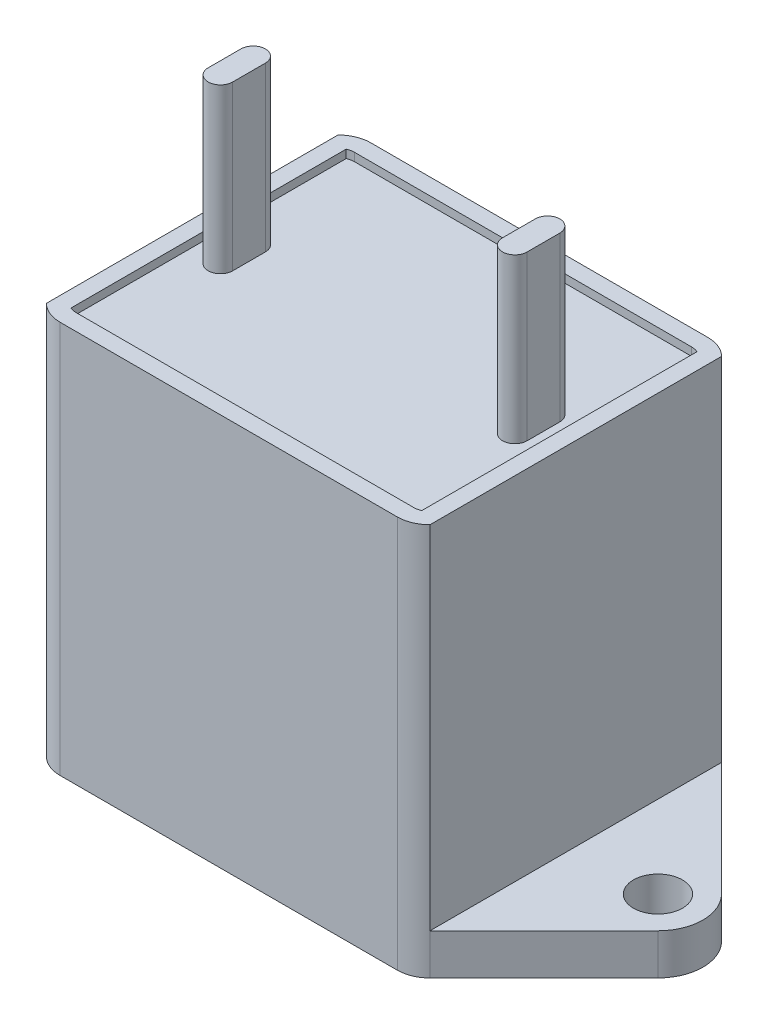
ISO-10303-21;
HEADER;
FILE_DESCRIPTION(('STEP AP214'),'2;1');
FILE_NAME('part.step','',(''),(''),'','','');
FILE_SCHEMA(('AUTOMOTIVE_DESIGN { 1 0 10303 214 1 1 1 1 }'));
ENDSEC;
DATA;
#1=APPLICATION_CONTEXT('core data for automotive mechanical design processes');
#2=APPLICATION_PROTOCOL_DEFINITION('international standard','automotive_design',2000,#1);
#3=PRODUCT_CONTEXT('',#1,'mechanical');
#4=PRODUCT('Part','Part','',(#3));
#5=PRODUCT_RELATED_PRODUCT_CATEGORY('part','',(#4));
#6=PRODUCT_DEFINITION_FORMATION('','',#4);
#7=PRODUCT_DEFINITION_CONTEXT('part definition',#1,'design');
#8=PRODUCT_DEFINITION('design','',#6,#7);
#9=PRODUCT_DEFINITION_SHAPE('','',#8);
#10=(LENGTH_UNIT() NAMED_UNIT(*) SI_UNIT(.MILLI.,.METRE.));
#11=(NAMED_UNIT(*) PLANE_ANGLE_UNIT() SI_UNIT($,.RADIAN.));
#12=(NAMED_UNIT(*) SI_UNIT($,.STERADIAN.) SOLID_ANGLE_UNIT());
#13=UNCERTAINTY_MEASURE_WITH_UNIT(LENGTH_MEASURE(1.E-05),#10,'distance_accuracy_value','');
#14=(GEOMETRIC_REPRESENTATION_CONTEXT(3) GLOBAL_UNCERTAINTY_ASSIGNED_CONTEXT((#13)) GLOBAL_UNIT_ASSIGNED_CONTEXT((#10,
#11,#12)) REPRESENTATION_CONTEXT('',''));
#15=CARTESIAN_POINT('',(0.,0.,0.));
#16=DIRECTION('',(0.,0.,1.));
#17=DIRECTION('',(1.,0.,0.));
#18=AXIS2_PLACEMENT_3D('',#15,#16,#17);
#19=CARTESIAN_POINT('',(10.3106601717799,23.5,7.5));
#20=DIRECTION('',(0.,1.,0.));
#21=DIRECTION('',(0.,0.,1.));
#22=AXIS2_PLACEMENT_3D('',#19,#20,#21);
#23=PLANE('',#22);
#24=CARTESIAN_POINT('',(10.3106601717799,23.5,7.5));
#25=DIRECTION('',(0.,1.,0.));
#26=DIRECTION('',(0.,0.,1.));
#27=AXIS2_PLACEMENT_3D('',#24,#25,#26);
#28=CIRCLE('',#27,1.);
#29=CARTESIAN_POINT('',(10.3106601717799,23.5,8.5));
#30=VERTEX_POINT('',#29);
#31=CARTESIAN_POINT('',(10.7248737341529,23.5,8.41017972112446));
#32=VERTEX_POINT('',#31);
#33=EDGE_CURVE('E292',#30,#32,#28,.T.);
#34=ORIENTED_EDGE('',*,*,#33,.T.);
#35=DIRECTION('',(0.,0.,-1.));
#36=VECTOR('',#35,1.);
#37=CARTESIAN_POINT('',(10.7248737341529,23.5,8.41017972112446));
#38=LINE('',#37,#36);
#39=CARTESIAN_POINT('',(10.724873734153,23.5,-8.41017972112445));
#40=VERTEX_POINT('',#39);
#41=EDGE_CURVE('E295',#32,#40,#38,.T.);
#42=ORIENTED_EDGE('',*,*,#41,.T.);
#43=CARTESIAN_POINT('',(10.3106601717799,23.5,-7.5));
#44=DIRECTION('',(0.,1.,0.));
#45=DIRECTION('',(0.,0.,1.));
#46=AXIS2_PLACEMENT_3D('',#43,#44,#45);
#47=CIRCLE('',#46,1.);
#48=CARTESIAN_POINT('',(10.3106601717799,23.5,-8.5));
#49=VERTEX_POINT('',#48);
#50=EDGE_CURVE('E299',#40,#49,#47,.T.);
#51=ORIENTED_EDGE('',*,*,#50,.T.);
#52=DIRECTION('',(-1.,0.,0.));
#53=VECTOR('',#52,1.);
#54=CARTESIAN_POINT('',(10.3106601717799,23.5,-8.5));
#55=LINE('',#54,#53);
#56=CARTESIAN_POINT('',(-10.3106601717799,23.5,-8.5));
#57=VERTEX_POINT('',#56);
#58=EDGE_CURVE('E302',#49,#57,#55,.T.);
#59=ORIENTED_EDGE('',*,*,#58,.T.);
#60=CARTESIAN_POINT('',(-10.3106601717799,23.5,-7.5));
#61=DIRECTION('',(0.,1.,0.));
#62=DIRECTION('',(0.,0.,1.));
#63=AXIS2_PLACEMENT_3D('',#60,#61,#62);
#64=CIRCLE('',#63,1.);
#65=CARTESIAN_POINT('',(-10.724873734153,23.5,-8.41017972112445));
#66=VERTEX_POINT('',#65);
#67=EDGE_CURVE('E305',#57,#66,#64,.T.);
#68=ORIENTED_EDGE('',*,*,#67,.T.);
#69=DIRECTION('',(0.,0.,1.));
#70=VECTOR('',#69,1.);
#71=CARTESIAN_POINT('',(-10.724873734153,23.5,-8.41017972112445));
#72=LINE('',#71,#70);
#73=CARTESIAN_POINT('',(-10.7248737341529,23.5,8.41017972112446));
#74=VERTEX_POINT('',#73);
#75=EDGE_CURVE('E308',#66,#74,#72,.T.);
#76=ORIENTED_EDGE('',*,*,#75,.T.);
#77=CARTESIAN_POINT('',(-10.3106601717798,23.5,7.5));
#78=DIRECTION('',(0.,1.,0.));
#79=DIRECTION('',(0.,0.,1.));
#80=AXIS2_PLACEMENT_3D('',#77,#78,#79);
#81=CIRCLE('',#80,1.);
#82=CARTESIAN_POINT('',(-10.3106601717798,23.5,8.5));
#83=VERTEX_POINT('',#82);
#84=EDGE_CURVE('E311',#74,#83,#81,.T.);
#85=ORIENTED_EDGE('',*,*,#84,.T.);
#86=DIRECTION('',(1.,0.,0.));
#87=VECTOR('',#86,1.);
#88=CARTESIAN_POINT('',(-10.3106601717798,23.5,8.5));
#89=LINE('',#88,#87);
#90=EDGE_CURVE('E314',#83,#30,#89,.T.);
#91=ORIENTED_EDGE('',*,*,#90,.T.);
#92=EDGE_LOOP('',(#34,#42,#51,#59,#68,#76,#85,#91));
#93=FACE_BOUND('',#92,.T.);
#94=DIRECTION('',(0.,0.,1.));
#95=VECTOR('',#94,1.);
#96=CARTESIAN_POINT('',(-9.75,23.5,-1.));
#97=LINE('',#96,#95);
#98=CARTESIAN_POINT('',(-9.75,23.5,-1.));
#99=VERTEX_POINT('',#98);
#100=CARTESIAN_POINT('',(-9.75,23.5,1.));
#101=VERTEX_POINT('',#100);
#102=EDGE_CURVE('E263',#99,#101,#97,.T.);
#103=ORIENTED_EDGE('',*,*,#102,.F.);
#104=CARTESIAN_POINT('',(-9.,23.5,-1.));
#105=DIRECTION('',(0.,1.,0.));
#106=DIRECTION('',(0.,0.,1.));
#107=AXIS2_PLACEMENT_3D('',#104,#105,#106);
#108=CIRCLE('',#107,0.750000000000001);
#109=CARTESIAN_POINT('',(-8.25,23.5,-1.));
#110=VERTEX_POINT('',#109);
#111=EDGE_CURVE('E260',#110,#99,#108,.T.);
#112=ORIENTED_EDGE('',*,*,#111,.F.);
#113=DIRECTION('',(0.,0.,-1.));
#114=VECTOR('',#113,1.);
#115=CARTESIAN_POINT('',(-8.25,23.5,-1.));
#116=LINE('',#115,#114);
#117=CARTESIAN_POINT('',(-8.24999999999999,23.5,1.));
#118=VERTEX_POINT('',#117);
#119=EDGE_CURVE('E272',#118,#110,#116,.T.);
#120=ORIENTED_EDGE('',*,*,#119,.F.);
#121=CARTESIAN_POINT('',(-9.,23.5,1.));
#122=DIRECTION('',(0.,1.,0.));
#123=DIRECTION('',(0.,0.,1.));
#124=AXIS2_PLACEMENT_3D('',#121,#122,#123);
#125=CIRCLE('',#124,0.750000000000001);
#126=EDGE_CURVE('E280',#101,#118,#125,.T.);
#127=ORIENTED_EDGE('',*,*,#126,.F.);
#128=EDGE_LOOP('',(#103,#112,#120,#127));
#129=FACE_BOUND('',#128,.T.);
#130=DIRECTION('',(0.,0.,1.));
#131=VECTOR('',#130,1.);
#132=CARTESIAN_POINT('',(8.24999999999999,23.5,-1.));
#133=LINE('',#132,#131);
#134=CARTESIAN_POINT('',(8.24999999999999,23.5,-1.));
#135=VERTEX_POINT('',#134);
#136=CARTESIAN_POINT('',(8.24999999999999,23.5,1.));
#137=VERTEX_POINT('',#136);
#138=EDGE_CURVE('E974',#135,#137,#133,.T.);
#139=ORIENTED_EDGE('',*,*,#138,.F.);
#140=CARTESIAN_POINT('',(8.99999999999999,23.5,-1.));
#141=DIRECTION('',(0.,1.,0.));
#142=DIRECTION('',(0.,0.,-1.));
#143=AXIS2_PLACEMENT_3D('',#140,#141,#142);
#144=CIRCLE('',#143,0.750000000000001);
#145=CARTESIAN_POINT('',(9.74999999999999,23.5,-1.));
#146=VERTEX_POINT('',#145);
#147=EDGE_CURVE('E258',#146,#135,#144,.T.);
#148=ORIENTED_EDGE('',*,*,#147,.F.);
#149=DIRECTION('',(0.,0.,-1.));
#150=VECTOR('',#149,1.);
#151=CARTESIAN_POINT('',(9.74999999999999,23.5,-1.));
#152=LINE('',#151,#150);
#153=CARTESIAN_POINT('',(9.74999999999999,23.5,1.));
#154=VERTEX_POINT('',#153);
#155=EDGE_CURVE('E254',#154,#146,#152,.T.);
#156=ORIENTED_EDGE('',*,*,#155,.F.);
#157=CARTESIAN_POINT('',(8.99999999999999,23.5,1.));
#158=DIRECTION('',(0.,1.,0.));
#159=DIRECTION('',(0.,0.,-1.));
#160=AXIS2_PLACEMENT_3D('',#157,#158,#159);
#161=CIRCLE('',#160,0.750000000000001);
#162=EDGE_CURVE('E971',#137,#154,#161,.T.);
#163=ORIENTED_EDGE('',*,*,#162,.F.);
#164=EDGE_LOOP('',(#139,#148,#156,#163));
#165=FACE_BOUND('',#164,.T.);
#166=ADVANCED_FACE('F37',(#93,#129,#165),#23,.T.);
#167=CARTESIAN_POINT('',(0.,2.5,0.));
#168=DIRECTION('',(0.,1.,0.));
#169=DIRECTION('',(0.,0.,1.));
#170=AXIS2_PLACEMENT_3D('',#167,#168,#169);
#171=PLANE('',#170);
#172=CARTESIAN_POINT('',(16.75,2.5,0.));
#173=DIRECTION('',(0.,1.,0.));
#174=DIRECTION('',(0.,0.,1.));
#175=AXIS2_PLACEMENT_3D('',#172,#173,#174);
#176=CIRCLE('',#175,1.5);
#177=CARTESIAN_POINT('',(16.75,2.5,1.5));
#178=VERTEX_POINT('',#177);
#179=EDGE_CURVE('E417',#178,#178,#176,.F.);
#180=ORIENTED_EDGE('',*,*,#179,.T.);
#181=EDGE_LOOP('',(#180));
#182=FACE_BOUND('',#181,.T.);
#183=DIRECTION('',(-0.707106781186546,0.,-0.707106781186549));
#184=VECTOR('',#183,1.);
#185=CARTESIAN_POINT('',(10.319543648263,2.5,-10.319543648263));
#186=LINE('',#185,#184);
#187=CARTESIAN_POINT('',(18.694543648263,2.5,-1.944543648263));
#188=VERTEX_POINT('',#187);
#189=CARTESIAN_POINT('',(11.724873734153,2.5,-8.91421356237309));
#190=VERTEX_POINT('',#189);
#191=EDGE_CURVE('E404',#188,#190,#186,.T.);
#192=ORIENTED_EDGE('',*,*,#191,.T.);
#193=DIRECTION('',(0.,0.,1.));
#194=VECTOR('',#193,1.);
#195=CARTESIAN_POINT('',(11.7248737341529,2.5,0.));
#196=LINE('',#195,#194);
#197=CARTESIAN_POINT('',(11.724873734153,2.5,8.9142135623731));
#198=VERTEX_POINT('',#197);
#199=EDGE_CURVE('E361',#190,#198,#196,.T.);
#200=ORIENTED_EDGE('',*,*,#199,.T.);
#201=DIRECTION('',(-0.707106781186546,0.,0.707106781186549));
#202=VECTOR('',#201,1.);
#203=CARTESIAN_POINT('',(10.319543648263,2.5,10.319543648263));
#204=LINE('',#203,#202);
#205=CARTESIAN_POINT('',(18.694543648263,2.5,1.944543648263));
#206=VERTEX_POINT('',#205);
#207=EDGE_CURVE('E397',#206,#198,#204,.T.);
#208=ORIENTED_EDGE('',*,*,#207,.F.);
#209=CARTESIAN_POINT('',(16.75,2.5,0.));
#210=DIRECTION('',(0.,1.,0.));
#211=DIRECTION('',(0.,0.,1.));
#212=AXIS2_PLACEMENT_3D('',#209,#210,#211);
#213=CIRCLE('',#212,2.75);
#214=EDGE_CURVE('E400',#188,#206,#213,.F.);
#215=ORIENTED_EDGE('',*,*,#214,.F.);
#216=EDGE_LOOP('',(#192,#200,#208,#215));
#217=FACE_BOUND('',#216,.T.);
#218=ADVANCED_FACE('F539',(#182,#217),#171,.T.);
#219=CARTESIAN_POINT('',(10.319543648263,2.5,10.319543648263));
#220=DIRECTION('',(0.707106781186549,0.,0.707106781186546));
#221=DIRECTION('',(0.707106781186546,0.,-0.707106781186549));
#222=AXIS2_PLACEMENT_3D('',#219,#220,#221);
#223=PLANE('',#222);
#224=ORIENTED_EDGE('',*,*,#207,.T.);
#225=DIRECTION('',(0.,-1.,0.));
#226=VECTOR('',#225,1.);
#227=CARTESIAN_POINT('',(11.724873734153,0.,8.9142135623731));
#228=LINE('',#227,#226);
#229=CARTESIAN_POINT('',(11.724873734153,0.,8.9142135623731));
#230=VERTEX_POINT('',#229);
#231=EDGE_CURVE('E474',#198,#230,#228,.T.);
#232=ORIENTED_EDGE('',*,*,#231,.T.);
#233=DIRECTION('',(-0.707106781186546,0.,0.707106781186549));
#234=VECTOR('',#233,1.);
#235=CARTESIAN_POINT('',(10.319543648263,0.,10.319543648263));
#236=LINE('',#235,#234);
#237=CARTESIAN_POINT('',(18.694543648263,0.,1.944543648263));
#238=VERTEX_POINT('',#237);
#239=EDGE_CURVE('E387',#238,#230,#236,.T.);
#240=ORIENTED_EDGE('',*,*,#239,.F.);
#241=DIRECTION('',(0.,-1.,0.));
#242=VECTOR('',#241,1.);
#243=CARTESIAN_POINT('',(18.694543648263,2.5,1.944543648263));
#244=LINE('',#243,#242);
#245=EDGE_CURVE('E454',#206,#238,#244,.T.);
#246=ORIENTED_EDGE('',*,*,#245,.F.);
#247=EDGE_LOOP('',(#224,#232,#240,#246));
#248=FACE_BOUND('',#247,.T.);
#249=ADVANCED_FACE('F533',(#248),#223,.T.);
#250=CARTESIAN_POINT('',(16.75,2.5,0.));
#251=DIRECTION('',(0.,-1.,0.));
#252=DIRECTION('',(0.,0.,-1.));
#253=AXIS2_PLACEMENT_3D('',#250,#251,#252);
#254=CYLINDRICAL_SURFACE('',#253,2.75);
#255=CARTESIAN_POINT('',(16.75,0.,0.));
#256=DIRECTION('',(0.,1.,0.));
#257=DIRECTION('',(0.,0.,1.));
#258=AXIS2_PLACEMENT_3D('',#255,#256,#257);
#259=CIRCLE('',#258,2.75);
#260=CARTESIAN_POINT('',(18.694543648263,0.,-1.944543648263));
#261=VERTEX_POINT('',#260);
#262=EDGE_CURVE('E423',#261,#238,#259,.F.);
#263=ORIENTED_EDGE('',*,*,#262,.F.);
#264=DIRECTION('',(0.,-1.,0.));
#265=VECTOR('',#264,1.);
#266=CARTESIAN_POINT('',(18.694543648263,2.5,-1.944543648263));
#267=LINE('',#266,#265);
#268=EDGE_CURVE('E452',#188,#261,#267,.T.);
#269=ORIENTED_EDGE('',*,*,#268,.F.);
#270=ORIENTED_EDGE('',*,*,#214,.T.);
#271=ORIENTED_EDGE('',*,*,#245,.T.);
#272=EDGE_LOOP('',(#263,#269,#270,#271));
#273=FACE_BOUND('',#272,.T.);
#274=ADVANCED_FACE('F530',(#273),#254,.T.);
#275=CARTESIAN_POINT('',(10.319543648263,2.5,-10.319543648263));
#276=DIRECTION('',(-0.707106781186549,0.,0.707106781186546));
#277=DIRECTION('',(0.707106781186546,0.,0.707106781186549));
#278=AXIS2_PLACEMENT_3D('',#275,#276,#277);
#279=PLANE('',#278);
#280=DIRECTION('',(-0.707106781186546,0.,-0.707106781186549));
#281=VECTOR('',#280,1.);
#282=CARTESIAN_POINT('',(10.319543648263,0.,-10.319543648263));
#283=LINE('',#282,#281);
#284=CARTESIAN_POINT('',(11.724873734153,0.,-8.91421356237309));
#285=VERTEX_POINT('',#284);
#286=EDGE_CURVE('E426',#261,#285,#283,.T.);
#287=ORIENTED_EDGE('',*,*,#286,.T.);
#288=DIRECTION('',(0.,-1.,0.));
#289=VECTOR('',#288,1.);
#290=CARTESIAN_POINT('',(11.724873734153,2.5,-8.91421356237309));
#291=LINE('',#290,#289);
#292=EDGE_CURVE('E472',#285,#190,#291,.F.);
#293=ORIENTED_EDGE('',*,*,#292,.T.);
#294=ORIENTED_EDGE('',*,*,#191,.F.);
#295=ORIENTED_EDGE('',*,*,#268,.T.);
#296=EDGE_LOOP('',(#287,#293,#294,#295));
#297=FACE_BOUND('',#296,.T.);
#298=ADVANCED_FACE('F526',(#297),#279,.F.);
#299=CARTESIAN_POINT('',(0.,2.5,-9.5));
#300=DIRECTION('',(0.,0.,-1.));
#301=DIRECTION('',(-1.,0.,0.));
#302=AXIS2_PLACEMENT_3D('',#299,#300,#301);
#303=PLANE('',#302);
#304=DIRECTION('',(1.,0.,0.));
#305=VECTOR('',#304,1.);
#306=CARTESIAN_POINT('',(0.,0.,-9.5));
#307=LINE('',#306,#305);
#308=CARTESIAN_POINT('',(-10.3106601717799,0.,-9.5));
#309=VERTEX_POINT('',#308);
#310=CARTESIAN_POINT('',(10.3106601717799,0.,-9.5));
#311=VERTEX_POINT('',#310);
#312=EDGE_CURVE('E429',#309,#311,#307,.T.);
#313=ORIENTED_EDGE('',*,*,#312,.F.);
#314=DIRECTION('',(0.,-1.,0.));
#315=VECTOR('',#314,1.);
#316=CARTESIAN_POINT('',(-10.3106601717799,2.5,-9.5));
#317=LINE('',#316,#315);
#318=CARTESIAN_POINT('',(-10.3106601717799,24.,-9.5));
#319=VERTEX_POINT('',#318);
#320=EDGE_CURVE('E470',#309,#319,#317,.F.);
#321=ORIENTED_EDGE('',*,*,#320,.T.);
#322=DIRECTION('',(-1.,0.,0.));
#323=VECTOR('',#322,1.);
#324=CARTESIAN_POINT('',(0.,24.,-9.5));
#325=LINE('',#324,#323);
#326=CARTESIAN_POINT('',(10.3106601717799,24.,-9.5));
#327=VERTEX_POINT('',#326);
#328=EDGE_CURVE('E377',#327,#319,#325,.T.);
#329=ORIENTED_EDGE('',*,*,#328,.F.);
#330=DIRECTION('',(0.,-1.,0.));
#331=VECTOR('',#330,1.);
#332=CARTESIAN_POINT('',(10.3106601717799,0.,-9.5));
#333=LINE('',#332,#331);
#334=EDGE_CURVE('E467',#327,#311,#333,.T.);
#335=ORIENTED_EDGE('',*,*,#334,.T.);
#336=EDGE_LOOP('',(#313,#321,#329,#335));
#337=FACE_BOUND('',#336,.T.);
#338=ADVANCED_FACE('F517',(#337),#303,.T.);
#339=CARTESIAN_POINT('',(-10.319543648263,2.5,-10.319543648263));
#340=DIRECTION('',(-0.707106781186549,0.,-0.707106781186546));
#341=DIRECTION('',(-0.707106781186546,0.,0.707106781186549));
#342=AXIS2_PLACEMENT_3D('',#339,#340,#341);
#343=PLANE('',#342);
#344=DIRECTION('',(0.707106781186546,0.,-0.707106781186549));
#345=VECTOR('',#344,1.);
#346=CARTESIAN_POINT('',(-10.319543648263,2.5,-10.319543648263));
#347=LINE('',#346,#345);
#348=CARTESIAN_POINT('',(-18.694543648263,2.5,-1.944543648263));
#349=VERTEX_POINT('',#348);
#350=CARTESIAN_POINT('',(-11.724873734153,2.5,-8.91421356237309));
#351=VERTEX_POINT('',#350);
#352=EDGE_CURVE('E407',#349,#351,#347,.T.);
#353=ORIENTED_EDGE('',*,*,#352,.T.);
#354=DIRECTION('',(0.,-1.,0.));
#355=VECTOR('',#354,1.);
#356=CARTESIAN_POINT('',(-11.724873734153,2.5,-8.91421356237309));
#357=LINE('',#356,#355);
#358=CARTESIAN_POINT('',(-11.724873734153,0.,-8.91421356237309));
#359=VERTEX_POINT('',#358);
#360=EDGE_CURVE('E456',#351,#359,#357,.T.);
#361=ORIENTED_EDGE('',*,*,#360,.T.);
#362=DIRECTION('',(0.707106781186546,0.,-0.707106781186549));
#363=VECTOR('',#362,1.);
#364=CARTESIAN_POINT('',(-10.319543648263,0.,-10.319543648263));
#365=LINE('',#364,#363);
#366=CARTESIAN_POINT('',(-18.694543648263,0.,-1.944543648263));
#367=VERTEX_POINT('',#366);
#368=EDGE_CURVE('E432',#367,#359,#365,.T.);
#369=ORIENTED_EDGE('',*,*,#368,.F.);
#370=DIRECTION('',(0.,-1.,0.));
#371=VECTOR('',#370,1.);
#372=CARTESIAN_POINT('',(-18.694543648263,2.5,-1.944543648263));
#373=LINE('',#372,#371);
#374=EDGE_CURVE('E450',#349,#367,#373,.T.);
#375=ORIENTED_EDGE('',*,*,#374,.F.);
#376=EDGE_LOOP('',(#353,#361,#369,#375));
#377=FACE_BOUND('',#376,.T.);
#378=ADVANCED_FACE('F504',(#377),#343,.T.);
#379=CARTESIAN_POINT('',(-16.75,2.5,0.));
#380=DIRECTION('',(0.,-1.,0.));
#381=DIRECTION('',(0.,0.,-1.));
#382=AXIS2_PLACEMENT_3D('',#379,#380,#381);
#383=CYLINDRICAL_SURFACE('',#382,2.75);
#384=CARTESIAN_POINT('',(-16.75,0.,0.));
#385=DIRECTION('',(0.,1.,0.));
#386=DIRECTION('',(0.,0.,1.));
#387=AXIS2_PLACEMENT_3D('',#384,#385,#386);
#388=CIRCLE('',#387,2.75);
#389=CARTESIAN_POINT('',(-18.694543648263,0.,1.944543648263));
#390=VERTEX_POINT('',#389);
#391=EDGE_CURVE('E435',#367,#390,#388,.T.);
#392=ORIENTED_EDGE('',*,*,#391,.T.);
#393=DIRECTION('',(0.,-1.,0.));
#394=VECTOR('',#393,1.);
#395=CARTESIAN_POINT('',(-18.694543648263,2.5,1.944543648263));
#396=LINE('',#395,#394);
#397=CARTESIAN_POINT('',(-18.694543648263,2.5,1.944543648263));
#398=VERTEX_POINT('',#397);
#399=EDGE_CURVE('E420',#398,#390,#396,.T.);
#400=ORIENTED_EDGE('',*,*,#399,.F.);
#401=CARTESIAN_POINT('',(-16.75,2.5,0.));
#402=DIRECTION('',(0.,1.,0.));
#403=DIRECTION('',(0.,0.,1.));
#404=AXIS2_PLACEMENT_3D('',#401,#402,#403);
#405=CIRCLE('',#404,2.75);
#406=EDGE_CURVE('E410',#349,#398,#405,.T.);
#407=ORIENTED_EDGE('',*,*,#406,.F.);
#408=ORIENTED_EDGE('',*,*,#374,.T.);
#409=EDGE_LOOP('',(#392,#400,#407,#408));
#410=FACE_BOUND('',#409,.T.);
#411=ADVANCED_FACE('F574',(#410),#383,.T.);
#412=CARTESIAN_POINT('',(-10.319543648263,2.5,10.319543648263));
#413=DIRECTION('',(0.707106781186549,0.,-0.707106781186546));
#414=DIRECTION('',(-0.707106781186546,0.,-0.707106781186549));
#415=AXIS2_PLACEMENT_3D('',#412,#413,#414);
#416=PLANE('',#415);
#417=DIRECTION('',(0.707106781186546,0.,0.707106781186549));
#418=VECTOR('',#417,1.);
#419=CARTESIAN_POINT('',(-10.319543648263,0.,10.319543648263));
#420=LINE('',#419,#418);
#421=CARTESIAN_POINT('',(-11.7248737341529,0.,8.9142135623731));
#422=VERTEX_POINT('',#421);
#423=EDGE_CURVE('E437',#390,#422,#420,.T.);
#424=ORIENTED_EDGE('',*,*,#423,.T.);
#425=DIRECTION('',(0.,-1.,0.));
#426=VECTOR('',#425,1.);
#427=CARTESIAN_POINT('',(-11.7248737341529,2.5,8.9142135623731));
#428=LINE('',#427,#426);
#429=CARTESIAN_POINT('',(-11.7248737341529,2.5,8.9142135623731));
#430=VERTEX_POINT('',#429);
#431=EDGE_CURVE('E12',#422,#430,#428,.F.);
#432=ORIENTED_EDGE('',*,*,#431,.T.);
#433=DIRECTION('',(0.707106781186546,0.,0.707106781186549));
#434=VECTOR('',#433,1.);
#435=CARTESIAN_POINT('',(-10.319543648263,2.5,10.319543648263));
#436=LINE('',#435,#434);
#437=EDGE_CURVE('E412',#398,#430,#436,.T.);
#438=ORIENTED_EDGE('',*,*,#437,.F.);
#439=ORIENTED_EDGE('',*,*,#399,.T.);
#440=EDGE_LOOP('',(#424,#432,#438,#439));
#441=FACE_BOUND('',#440,.T.);
#442=ADVANCED_FACE('F569',(#441),#416,.F.);
#443=CARTESIAN_POINT('',(-16.75,2.5,0.));
#444=DIRECTION('',(0.,-1.,0.));
#445=DIRECTION('',(0.,0.,-1.));
#446=AXIS2_PLACEMENT_3D('',#443,#444,#445);
#447=CYLINDRICAL_SURFACE('',#446,1.5);
#448=CARTESIAN_POINT('',(-16.75,2.5,0.));
#449=DIRECTION('',(0.,1.,0.));
#450=DIRECTION('',(0.,0.,1.));
#451=AXIS2_PLACEMENT_3D('',#448,#449,#450);
#452=CIRCLE('',#451,1.5);
#453=CARTESIAN_POINT('',(-16.75,2.5,1.5));
#454=VERTEX_POINT('',#453);
#455=EDGE_CURVE('E414',#454,#454,#452,.T.);
#456=ORIENTED_EDGE('',*,*,#455,.T.);
#457=EDGE_LOOP('',(#456));
#458=FACE_BOUND('',#457,.T.);
#459=CARTESIAN_POINT('',(-16.75,0.,0.));
#460=DIRECTION('',(0.,1.,0.));
#461=DIRECTION('',(0.,0.,1.));
#462=AXIS2_PLACEMENT_3D('',#459,#460,#461);
#463=CIRCLE('',#462,1.5);
#464=CARTESIAN_POINT('',(-16.75,0.,1.5));
#465=VERTEX_POINT('',#464);
#466=EDGE_CURVE('E443',#465,#465,#463,.T.);
#467=ORIENTED_EDGE('',*,*,#466,.F.);
#468=EDGE_LOOP('',(#467));
#469=FACE_BOUND('',#468,.T.);
#470=ADVANCED_FACE('F563',(#458,#469),#447,.F.);
#471=CARTESIAN_POINT('',(0.,2.5,9.5));
#472=DIRECTION('',(0.,0.,-1.));
#473=DIRECTION('',(-1.,0.,0.));
#474=AXIS2_PLACEMENT_3D('',#471,#472,#473);
#475=PLANE('',#474);
#476=DIRECTION('',(1.,0.,0.));
#477=VECTOR('',#476,1.);
#478=CARTESIAN_POINT('',(0.,0.,9.5));
#479=LINE('',#478,#477);
#480=CARTESIAN_POINT('',(-10.3106601717798,0.,9.5));
#481=VERTEX_POINT('',#480);
#482=CARTESIAN_POINT('',(10.3106601717799,0.,9.5));
#483=VERTEX_POINT('',#482);
#484=EDGE_CURVE('E440',#481,#483,#479,.T.);
#485=ORIENTED_EDGE('',*,*,#484,.T.);
#486=DIRECTION('',(0.,-1.,0.));
#487=VECTOR('',#486,1.);
#488=CARTESIAN_POINT('',(10.3106601717799,2.5,9.5));
#489=LINE('',#488,#487);
#490=CARTESIAN_POINT('',(10.3106601717799,24.,9.5));
#491=VERTEX_POINT('',#490);
#492=EDGE_CURVE('E45',#483,#491,#489,.F.);
#493=ORIENTED_EDGE('',*,*,#492,.T.);
#494=DIRECTION('',(1.,0.,0.));
#495=VECTOR('',#494,1.);
#496=CARTESIAN_POINT('',(0.,24.,9.5));
#497=LINE('',#496,#495);
#498=CARTESIAN_POINT('',(-10.3106601717798,24.,9.5));
#499=VERTEX_POINT('',#498);
#500=EDGE_CURVE('E364',#499,#491,#497,.T.);
#501=ORIENTED_EDGE('',*,*,#500,.F.);
#502=DIRECTION('',(0.,-1.,0.));
#503=VECTOR('',#502,1.);
#504=CARTESIAN_POINT('',(-10.3106601717798,2.5,9.5));
#505=LINE('',#504,#503);
#506=EDGE_CURVE('E477',#499,#481,#505,.T.);
#507=ORIENTED_EDGE('',*,*,#506,.T.);
#508=EDGE_LOOP('',(#485,#493,#501,#507));
#509=FACE_BOUND('',#508,.T.);
#510=ADVANCED_FACE('F483',(#509),#475,.F.);
#511=CARTESIAN_POINT('',(16.75,2.5,0.));
#512=DIRECTION('',(0.,-1.,0.));
#513=DIRECTION('',(0.,0.,-1.));
#514=AXIS2_PLACEMENT_3D('',#511,#512,#513);
#515=CYLINDRICAL_SURFACE('',#514,1.5);
#516=ORIENTED_EDGE('',*,*,#179,.F.);
#517=EDGE_LOOP('',(#516));
#518=FACE_BOUND('',#517,.T.);
#519=CARTESIAN_POINT('',(16.75,0.,0.));
#520=DIRECTION('',(0.,1.,0.));
#521=DIRECTION('',(0.,0.,1.));
#522=AXIS2_PLACEMENT_3D('',#519,#520,#521);
#523=CIRCLE('',#522,1.5);
#524=CARTESIAN_POINT('',(16.75,0.,1.5));
#525=VERTEX_POINT('',#524);
#526=EDGE_CURVE('E401',#525,#525,#523,.F.);
#527=ORIENTED_EDGE('',*,*,#526,.T.);
#528=EDGE_LOOP('',(#527));
#529=FACE_BOUND('',#528,.T.);
#530=ADVANCED_FACE('F553',(#518,#529),#515,.F.);
#531=DIRECTION('',(0.,0.,1.));
#532=VECTOR('',#531,1.);
#533=CARTESIAN_POINT('',(-11.724873734153,2.5,0.));
#534=LINE('',#533,#532);
#535=EDGE_CURVE('E356',#351,#430,#534,.T.);
#536=ORIENTED_EDGE('',*,*,#535,.F.);
#537=ORIENTED_EDGE('',*,*,#352,.F.);
#538=ORIENTED_EDGE('',*,*,#406,.T.);
#539=ORIENTED_EDGE('',*,*,#437,.T.);
#540=EDGE_LOOP('',(#536,#537,#538,#539));
#541=FACE_BOUND('',#540,.T.);
#542=ORIENTED_EDGE('',*,*,#455,.F.);
#543=EDGE_LOOP('',(#542));
#544=FACE_BOUND('',#543,.T.);
#545=ADVANCED_FACE('F499',(#541,#544),#171,.T.);
#546=CARTESIAN_POINT('',(0.,0.,0.));
#547=DIRECTION('',(0.,1.,0.));
#548=DIRECTION('',(0.,0.,1.));
#549=AXIS2_PLACEMENT_3D('',#546,#547,#548);
#550=PLANE('',#549);
#551=ORIENTED_EDGE('',*,*,#368,.T.);
#552=CARTESIAN_POINT('',(-10.3106601717799,0.,-7.5));
#553=DIRECTION('',(0.,1.,0.));
#554=DIRECTION('',(0.,0.,1.));
#555=AXIS2_PLACEMENT_3D('',#552,#553,#554);
#556=CIRCLE('',#555,2.);
#557=EDGE_CURVE('E465',#359,#309,#556,.F.);
#558=ORIENTED_EDGE('',*,*,#557,.T.);
#559=ORIENTED_EDGE('',*,*,#312,.T.);
#560=CARTESIAN_POINT('',(10.3106601717799,0.,-7.5));
#561=DIRECTION('',(0.,1.,0.));
#562=DIRECTION('',(0.,0.,1.));
#563=AXIS2_PLACEMENT_3D('',#560,#561,#562);
#564=CIRCLE('',#563,2.);
#565=EDGE_CURVE('E463',#311,#285,#564,.F.);
#566=ORIENTED_EDGE('',*,*,#565,.T.);
#567=ORIENTED_EDGE('',*,*,#286,.F.);
#568=ORIENTED_EDGE('',*,*,#262,.T.);
#569=ORIENTED_EDGE('',*,*,#239,.T.);
#570=CARTESIAN_POINT('',(10.3106601717799,0.,7.5));
#571=DIRECTION('',(0.,1.,0.));
#572=DIRECTION('',(0.,0.,1.));
#573=AXIS2_PLACEMENT_3D('',#570,#571,#572);
#574=CIRCLE('',#573,2.);
#575=EDGE_CURVE('E461',#230,#483,#574,.F.);
#576=ORIENTED_EDGE('',*,*,#575,.T.);
#577=ORIENTED_EDGE('',*,*,#484,.F.);
#578=CARTESIAN_POINT('',(-10.3106601717798,0.,7.5));
#579=DIRECTION('',(0.,1.,0.));
#580=DIRECTION('',(0.,0.,1.));
#581=AXIS2_PLACEMENT_3D('',#578,#579,#580);
#582=CIRCLE('',#581,2.);
#583=EDGE_CURVE('E459',#481,#422,#582,.F.);
#584=ORIENTED_EDGE('',*,*,#583,.T.);
#585=ORIENTED_EDGE('',*,*,#423,.F.);
#586=ORIENTED_EDGE('',*,*,#391,.F.);
#587=EDGE_LOOP('',(#551,#558,#559,#566,#567,#568,#569,#576,#577,#584,#585,#586));
#588=FACE_BOUND('',#587,.T.);
#589=ORIENTED_EDGE('',*,*,#466,.T.);
#590=EDGE_LOOP('',(#589));
#591=FACE_BOUND('',#590,.T.);
#592=ORIENTED_EDGE('',*,*,#526,.F.);
#593=EDGE_LOOP('',(#592));
#594=FACE_BOUND('',#593,.T.);
#595=ADVANCED_FACE('F513',(#588,#591,#594),#550,.F.);
#596=CARTESIAN_POINT('',(-10.3106601717799,2.5,-7.5));
#597=DIRECTION('',(0.,-1.,0.));
#598=DIRECTION('',(0.,0.,-1.));
#599=AXIS2_PLACEMENT_3D('',#596,#597,#598);
#600=CYLINDRICAL_SURFACE('',#599,2.);
#601=ORIENTED_EDGE('',*,*,#360,.F.);
#602=DIRECTION('',(0.,-1.,0.));
#603=VECTOR('',#602,1.);
#604=CARTESIAN_POINT('',(-11.724873734153,78.1809651324692,-8.91421356237309));
#605=LINE('',#604,#603);
#606=CARTESIAN_POINT('',(-11.724873734153,24.,-8.91421356237309));
#607=VERTEX_POINT('',#606);
#608=EDGE_CURVE('E360',#607,#351,#605,.T.);
#609=ORIENTED_EDGE('',*,*,#608,.F.);
#610=CARTESIAN_POINT('',(-10.3106601717799,24.,-7.5));
#611=DIRECTION('',(0.,1.,0.));
#612=DIRECTION('',(0.,0.,1.));
#613=AXIS2_PLACEMENT_3D('',#610,#611,#612);
#614=CIRCLE('',#613,2.);
#615=EDGE_CURVE('E374',#319,#607,#614,.T.);
#616=ORIENTED_EDGE('',*,*,#615,.F.);
#617=ORIENTED_EDGE('',*,*,#320,.F.);
#618=ORIENTED_EDGE('',*,*,#557,.F.);
#619=EDGE_LOOP('',(#601,#609,#616,#617,#618));
#620=FACE_BOUND('',#619,.T.);
#621=ADVANCED_FACE('F508',(#620),#600,.T.);
#622=CARTESIAN_POINT('',(10.3106601717799,2.5,-7.5));
#623=DIRECTION('',(0.,1.,0.));
#624=DIRECTION('',(0.,0.,1.));
#625=AXIS2_PLACEMENT_3D('',#622,#623,#624);
#626=CYLINDRICAL_SURFACE('',#625,2.);
#627=ORIENTED_EDGE('',*,*,#334,.F.);
#628=CARTESIAN_POINT('',(10.3106601717799,24.,-7.5));
#629=DIRECTION('',(0.,1.,0.));
#630=DIRECTION('',(0.,0.,1.));
#631=AXIS2_PLACEMENT_3D('',#628,#629,#630);
#632=CIRCLE('',#631,2.);
#633=CARTESIAN_POINT('',(11.724873734153,24.,-8.91421356237309));
#634=VERTEX_POINT('',#633);
#635=EDGE_CURVE('E363',#634,#327,#632,.T.);
#636=ORIENTED_EDGE('',*,*,#635,.F.);
#637=DIRECTION('',(0.,-1.,0.));
#638=VECTOR('',#637,1.);
#639=CARTESIAN_POINT('',(11.724873734153,78.1809651324692,-8.91421356237309));
#640=LINE('',#639,#638);
#641=EDGE_CURVE('E388',#634,#190,#640,.T.);
#642=ORIENTED_EDGE('',*,*,#641,.T.);
#643=ORIENTED_EDGE('',*,*,#292,.F.);
#644=ORIENTED_EDGE('',*,*,#565,.F.);
#645=EDGE_LOOP('',(#627,#636,#642,#643,#644));
#646=FACE_BOUND('',#645,.T.);
#647=ADVANCED_FACE('F520',(#646),#626,.T.);
#648=CARTESIAN_POINT('',(10.3106601717799,2.5,7.5));
#649=DIRECTION('',(0.,1.,0.));
#650=DIRECTION('',(0.,0.,1.));
#651=AXIS2_PLACEMENT_3D('',#648,#649,#650);
#652=CYLINDRICAL_SURFACE('',#651,2.);
#653=ORIENTED_EDGE('',*,*,#231,.F.);
#654=DIRECTION('',(0.,-1.,0.));
#655=VECTOR('',#654,1.);
#656=CARTESIAN_POINT('',(11.724873734153,78.1809651324692,8.9142135623731));
#657=LINE('',#656,#655);
#658=CARTESIAN_POINT('',(11.724873734153,24.,8.9142135623731));
#659=VERTEX_POINT('',#658);
#660=EDGE_CURVE('E384',#659,#198,#657,.T.);
#661=ORIENTED_EDGE('',*,*,#660,.F.);
#662=CARTESIAN_POINT('',(10.3106601717799,24.,7.5));
#663=DIRECTION('',(0.,1.,0.));
#664=DIRECTION('',(0.,0.,1.));
#665=AXIS2_PLACEMENT_3D('',#662,#663,#664);
#666=CIRCLE('',#665,2.);
#667=EDGE_CURVE('E367',#491,#659,#666,.T.);
#668=ORIENTED_EDGE('',*,*,#667,.F.);
#669=ORIENTED_EDGE('',*,*,#492,.F.);
#670=ORIENTED_EDGE('',*,*,#575,.F.);
#671=EDGE_LOOP('',(#653,#661,#668,#669,#670));
#672=FACE_BOUND('',#671,.T.);
#673=ADVANCED_FACE('F487',(#672),#652,.T.);
#674=CARTESIAN_POINT('',(-10.3106601717798,2.5,7.5));
#675=DIRECTION('',(0.,-1.,0.));
#676=DIRECTION('',(0.,0.,-1.));
#677=AXIS2_PLACEMENT_3D('',#674,#675,#676);
#678=CYLINDRICAL_SURFACE('',#677,2.);
#679=ORIENTED_EDGE('',*,*,#506,.F.);
#680=CARTESIAN_POINT('',(-10.3106601717798,24.,7.5));
#681=DIRECTION('',(0.,1.,0.));
#682=DIRECTION('',(0.,0.,1.));
#683=AXIS2_PLACEMENT_3D('',#680,#681,#682);
#684=CIRCLE('',#683,2.);
#685=CARTESIAN_POINT('',(-11.7248737341529,24.,8.9142135623731));
#686=VERTEX_POINT('',#685);
#687=EDGE_CURVE('E368',#686,#499,#684,.T.);
#688=ORIENTED_EDGE('',*,*,#687,.F.);
#689=DIRECTION('',(0.,-1.,0.));
#690=VECTOR('',#689,1.);
#691=CARTESIAN_POINT('',(-11.7248737341529,78.1809651324692,8.9142135623731));
#692=LINE('',#691,#690);
#693=EDGE_CURVE('E359',#686,#430,#692,.T.);
#694=ORIENTED_EDGE('',*,*,#693,.T.);
#695=ORIENTED_EDGE('',*,*,#431,.F.);
#696=ORIENTED_EDGE('',*,*,#583,.F.);
#697=EDGE_LOOP('',(#679,#688,#694,#695,#696));
#698=FACE_BOUND('',#697,.T.);
#699=ADVANCED_FACE('F39',(#698),#678,.T.);
#700=CARTESIAN_POINT('',(11.7248737341529,78.1809651324692,0.));
#701=DIRECTION('',(1.,0.,0.));
#702=DIRECTION('',(0.,0.,-1.));
#703=AXIS2_PLACEMENT_3D('',#700,#701,#702);
#704=PLANE('',#703);
#705=ORIENTED_EDGE('',*,*,#641,.F.);
#706=DIRECTION('',(0.,0.,1.));
#707=VECTOR('',#706,1.);
#708=CARTESIAN_POINT('',(11.7248737341529,24.,0.));
#709=LINE('',#708,#707);
#710=EDGE_CURVE('E341',#634,#659,#709,.T.);
#711=ORIENTED_EDGE('',*,*,#710,.T.);
#712=ORIENTED_EDGE('',*,*,#660,.T.);
#713=ORIENTED_EDGE('',*,*,#199,.F.);
#714=EDGE_LOOP('',(#705,#711,#712,#713));
#715=FACE_BOUND('',#714,.T.);
#716=ADVANCED_FACE('F537',(#715),#704,.T.);
#717=CARTESIAN_POINT('',(-11.724873734153,78.1809651324692,0.));
#718=DIRECTION('',(1.,0.,0.));
#719=DIRECTION('',(0.,0.,-1.));
#720=AXIS2_PLACEMENT_3D('',#717,#718,#719);
#721=PLANE('',#720);
#722=DIRECTION('',(0.,0.,1.));
#723=VECTOR('',#722,1.);
#724=CARTESIAN_POINT('',(-11.724873734153,24.,0.));
#725=LINE('',#724,#723);
#726=EDGE_CURVE('E371',#607,#686,#725,.T.);
#727=ORIENTED_EDGE('',*,*,#726,.F.);
#728=ORIENTED_EDGE('',*,*,#608,.T.);
#729=ORIENTED_EDGE('',*,*,#535,.T.);
#730=ORIENTED_EDGE('',*,*,#693,.F.);
#731=EDGE_LOOP('',(#727,#728,#729,#730));
#732=FACE_BOUND('',#731,.T.);
#733=ADVANCED_FACE('F495',(#732),#721,.F.);
#734=CARTESIAN_POINT('',(0.,24.,0.));
#735=DIRECTION('',(0.,1.,0.));
#736=DIRECTION('',(0.,0.,1.));
#737=AXIS2_PLACEMENT_3D('',#734,#735,#736);
#738=PLANE('',#737);
#739=CARTESIAN_POINT('',(10.3106601717799,24.,7.5));
#740=DIRECTION('',(0.,1.,0.));
#741=DIRECTION('',(0.,0.,1.));
#742=AXIS2_PLACEMENT_3D('',#739,#740,#741);
#743=CIRCLE('',#742,1.);
#744=CARTESIAN_POINT('',(10.3106601717799,24.,8.5));
#745=VERTEX_POINT('',#744);
#746=CARTESIAN_POINT('',(10.7248737341529,24.,8.41017972112446));
#747=VERTEX_POINT('',#746);
#748=EDGE_CURVE('E291',#745,#747,#743,.T.);
#749=ORIENTED_EDGE('',*,*,#748,.F.);
#750=DIRECTION('',(1.,0.,0.));
#751=VECTOR('',#750,1.);
#752=CARTESIAN_POINT('',(-10.3106601717798,24.,8.5));
#753=LINE('',#752,#751);
#754=CARTESIAN_POINT('',(-10.3106601717798,24.,8.5));
#755=VERTEX_POINT('',#754);
#756=EDGE_CURVE('E296',#755,#745,#753,.T.);
#757=ORIENTED_EDGE('',*,*,#756,.F.);
#758=CARTESIAN_POINT('',(-10.3106601717798,24.,7.5));
#759=DIRECTION('',(0.,1.,0.));
#760=DIRECTION('',(0.,0.,1.));
#761=AXIS2_PLACEMENT_3D('',#758,#759,#760);
#762=CIRCLE('',#761,1.);
#763=CARTESIAN_POINT('',(-10.7248737341529,24.,8.41017972112446));
#764=VERTEX_POINT('',#763);
#765=EDGE_CURVE('E334',#764,#755,#762,.T.);
#766=ORIENTED_EDGE('',*,*,#765,.F.);
#767=DIRECTION('',(0.,0.,1.));
#768=VECTOR('',#767,1.);
#769=CARTESIAN_POINT('',(-10.724873734153,24.,-8.41017972112445));
#770=LINE('',#769,#768);
#771=CARTESIAN_POINT('',(-10.724873734153,24.,-8.41017972112445));
#772=VERTEX_POINT('',#771);
#773=EDGE_CURVE('E331',#772,#764,#770,.T.);
#774=ORIENTED_EDGE('',*,*,#773,.F.);
#775=CARTESIAN_POINT('',(-10.3106601717799,24.,-7.5));
#776=DIRECTION('',(0.,1.,0.));
#777=DIRECTION('',(0.,0.,1.));
#778=AXIS2_PLACEMENT_3D('',#775,#776,#777);
#779=CIRCLE('',#778,1.);
#780=CARTESIAN_POINT('',(-10.3106601717799,24.,-8.5));
#781=VERTEX_POINT('',#780);
#782=EDGE_CURVE('E328',#781,#772,#779,.T.);
#783=ORIENTED_EDGE('',*,*,#782,.F.);
#784=DIRECTION('',(-1.,0.,0.));
#785=VECTOR('',#784,1.);
#786=CARTESIAN_POINT('',(10.3106601717799,24.,-8.5));
#787=LINE('',#786,#785);
#788=CARTESIAN_POINT('',(10.3106601717799,24.,-8.5));
#789=VERTEX_POINT('',#788);
#790=EDGE_CURVE('E325',#789,#781,#787,.T.);
#791=ORIENTED_EDGE('',*,*,#790,.F.);
#792=CARTESIAN_POINT('',(10.3106601717799,24.,-7.5));
#793=DIRECTION('',(0.,1.,0.));
#794=DIRECTION('',(0.,0.,1.));
#795=AXIS2_PLACEMENT_3D('',#792,#793,#794);
#796=CIRCLE('',#795,1.);
#797=CARTESIAN_POINT('',(10.724873734153,24.,-8.41017972112445));
#798=VERTEX_POINT('',#797);
#799=EDGE_CURVE('E322',#798,#789,#796,.T.);
#800=ORIENTED_EDGE('',*,*,#799,.F.);
#801=DIRECTION('',(0.,0.,-1.));
#802=VECTOR('',#801,1.);
#803=CARTESIAN_POINT('',(10.7248737341529,24.,8.41017972112446));
#804=LINE('',#803,#802);
#805=EDGE_CURVE('E319',#747,#798,#804,.T.);
#806=ORIENTED_EDGE('',*,*,#805,.F.);
#807=EDGE_LOOP('',(#749,#757,#766,#774,#783,#791,#800,#806));
#808=FACE_BOUND('',#807,.T.);
#809=ORIENTED_EDGE('',*,*,#710,.F.);
#810=ORIENTED_EDGE('',*,*,#635,.T.);
#811=ORIENTED_EDGE('',*,*,#328,.T.);
#812=ORIENTED_EDGE('',*,*,#615,.T.);
#813=ORIENTED_EDGE('',*,*,#726,.T.);
#814=ORIENTED_EDGE('',*,*,#687,.T.);
#815=ORIENTED_EDGE('',*,*,#500,.T.);
#816=ORIENTED_EDGE('',*,*,#667,.T.);
#817=EDGE_LOOP('',(#809,#810,#811,#812,#813,#814,#815,#816));
#818=FACE_BOUND('',#817,.T.);
#819=ADVANCED_FACE('F490',(#808,#818),#738,.T.);
#820=CARTESIAN_POINT('',(10.3106601717799,23.5,7.5));
#821=DIRECTION('',(0.,1.,0.));
#822=DIRECTION('',(0.,0.,1.));
#823=AXIS2_PLACEMENT_3D('',#820,#821,#822);
#824=CYLINDRICAL_SURFACE('',#823,1.);
#825=ORIENTED_EDGE('',*,*,#748,.T.);
#826=DIRECTION('',(0.,1.,0.));
#827=VECTOR('',#826,1.);
#828=CARTESIAN_POINT('',(10.7248737341529,23.5,8.41017972112446));
#829=LINE('',#828,#827);
#830=EDGE_CURVE('E317',#32,#747,#829,.T.);
#831=ORIENTED_EDGE('',*,*,#830,.F.);
#832=ORIENTED_EDGE('',*,*,#33,.F.);
#833=DIRECTION('',(0.,1.,0.));
#834=VECTOR('',#833,1.);
#835=CARTESIAN_POINT('',(10.3106601717799,23.5,8.5));
#836=LINE('',#835,#834);
#837=EDGE_CURVE('E339',#30,#745,#836,.T.);
#838=ORIENTED_EDGE('',*,*,#837,.T.);
#839=EDGE_LOOP('',(#825,#831,#832,#838));
#840=FACE_BOUND('',#839,.T.);
#841=ADVANCED_FACE('F604',(#840),#824,.F.);
#842=CARTESIAN_POINT('',(-10.3106601717798,23.5,8.5));
#843=DIRECTION('',(0.,0.,1.));
#844=DIRECTION('',(1.,0.,0.));
#845=AXIS2_PLACEMENT_3D('',#842,#843,#844);
#846=PLANE('',#845);
#847=ORIENTED_EDGE('',*,*,#756,.T.);
#848=ORIENTED_EDGE('',*,*,#837,.F.);
#849=ORIENTED_EDGE('',*,*,#90,.F.);
#850=DIRECTION('',(0.,1.,0.));
#851=VECTOR('',#850,1.);
#852=CARTESIAN_POINT('',(-10.3106601717798,23.5,8.5));
#853=LINE('',#852,#851);
#854=EDGE_CURVE('E342',#83,#755,#853,.T.);
#855=ORIENTED_EDGE('',*,*,#854,.T.);
#856=EDGE_LOOP('',(#847,#848,#849,#855));
#857=FACE_BOUND('',#856,.T.);
#858=ADVANCED_FACE('F609',(#857),#846,.F.);
#859=CARTESIAN_POINT('',(-10.3106601717798,23.5,7.5));
#860=DIRECTION('',(0.,1.,0.));
#861=DIRECTION('',(0.,0.,1.));
#862=AXIS2_PLACEMENT_3D('',#859,#860,#861);
#863=CYLINDRICAL_SURFACE('',#862,1.);
#864=ORIENTED_EDGE('',*,*,#765,.T.);
#865=ORIENTED_EDGE('',*,*,#854,.F.);
#866=ORIENTED_EDGE('',*,*,#84,.F.);
#867=DIRECTION('',(0.,1.,0.));
#868=VECTOR('',#867,1.);
#869=CARTESIAN_POINT('',(-10.7248737341529,23.5,8.41017972112446));
#870=LINE('',#869,#868);
#871=EDGE_CURVE('E344',#74,#764,#870,.T.);
#872=ORIENTED_EDGE('',*,*,#871,.T.);
#873=EDGE_LOOP('',(#864,#865,#866,#872));
#874=FACE_BOUND('',#873,.T.);
#875=ADVANCED_FACE('F626',(#874),#863,.F.);
#876=CARTESIAN_POINT('',(-10.724873734153,23.5,-8.41017972112445));
#877=DIRECTION('',(-1.,0.,0.));
#878=DIRECTION('',(0.,0.,1.));
#879=AXIS2_PLACEMENT_3D('',#876,#877,#878);
#880=PLANE('',#879);
#881=ORIENTED_EDGE('',*,*,#773,.T.);
#882=ORIENTED_EDGE('',*,*,#871,.F.);
#883=ORIENTED_EDGE('',*,*,#75,.F.);
#884=DIRECTION('',(0.,1.,0.));
#885=VECTOR('',#884,1.);
#886=CARTESIAN_POINT('',(-10.724873734153,23.5,-8.41017972112445));
#887=LINE('',#886,#885);
#888=EDGE_CURVE('E346',#66,#772,#887,.T.);
#889=ORIENTED_EDGE('',*,*,#888,.T.);
#890=EDGE_LOOP('',(#881,#882,#883,#889));
#891=FACE_BOUND('',#890,.T.);
#892=ADVANCED_FACE('F631',(#891),#880,.F.);
#893=CARTESIAN_POINT('',(-10.3106601717799,23.5,-7.5));
#894=DIRECTION('',(0.,1.,0.));
#895=DIRECTION('',(0.,0.,1.));
#896=AXIS2_PLACEMENT_3D('',#893,#894,#895);
#897=CYLINDRICAL_SURFACE('',#896,1.);
#898=ORIENTED_EDGE('',*,*,#782,.T.);
#899=ORIENTED_EDGE('',*,*,#888,.F.);
#900=ORIENTED_EDGE('',*,*,#67,.F.);
#901=DIRECTION('',(0.,1.,0.));
#902=VECTOR('',#901,1.);
#903=CARTESIAN_POINT('',(-10.3106601717799,23.5,-8.5));
#904=LINE('',#903,#902);
#905=EDGE_CURVE('E348',#57,#781,#904,.T.);
#906=ORIENTED_EDGE('',*,*,#905,.T.);
#907=EDGE_LOOP('',(#898,#899,#900,#906));
#908=FACE_BOUND('',#907,.T.);
#909=ADVANCED_FACE('F635',(#908),#897,.F.);
#910=CARTESIAN_POINT('',(10.3106601717799,23.5,-8.5));
#911=DIRECTION('',(0.,0.,-1.));
#912=DIRECTION('',(-1.,0.,0.));
#913=AXIS2_PLACEMENT_3D('',#910,#911,#912);
#914=PLANE('',#913);
#915=ORIENTED_EDGE('',*,*,#790,.T.);
#916=ORIENTED_EDGE('',*,*,#905,.F.);
#917=ORIENTED_EDGE('',*,*,#58,.F.);
#918=DIRECTION('',(0.,1.,0.));
#919=VECTOR('',#918,1.);
#920=CARTESIAN_POINT('',(10.3106601717799,23.5,-8.5));
#921=LINE('',#920,#919);
#922=EDGE_CURVE('E350',#49,#789,#921,.T.);
#923=ORIENTED_EDGE('',*,*,#922,.T.);
#924=EDGE_LOOP('',(#915,#916,#917,#923));
#925=FACE_BOUND('',#924,.T.);
#926=ADVANCED_FACE('F638',(#925),#914,.F.);
#927=CARTESIAN_POINT('',(10.3106601717799,23.5,-7.5));
#928=DIRECTION('',(0.,1.,0.));
#929=DIRECTION('',(0.,0.,1.));
#930=AXIS2_PLACEMENT_3D('',#927,#928,#929);
#931=CYLINDRICAL_SURFACE('',#930,1.);
#932=ORIENTED_EDGE('',*,*,#799,.T.);
#933=ORIENTED_EDGE('',*,*,#922,.F.);
#934=ORIENTED_EDGE('',*,*,#50,.F.);
#935=DIRECTION('',(0.,1.,0.));
#936=VECTOR('',#935,1.);
#937=CARTESIAN_POINT('',(10.724873734153,23.5,-8.41017972112445));
#938=LINE('',#937,#936);
#939=EDGE_CURVE('E352',#40,#798,#938,.T.);
#940=ORIENTED_EDGE('',*,*,#939,.T.);
#941=EDGE_LOOP('',(#932,#933,#934,#940));
#942=FACE_BOUND('',#941,.T.);
#943=ADVANCED_FACE('F640',(#942),#931,.F.);
#944=CARTESIAN_POINT('',(10.7248737341529,23.5,8.41017972112446));
#945=DIRECTION('',(1.,0.,0.));
#946=DIRECTION('',(0.,0.,-1.));
#947=AXIS2_PLACEMENT_3D('',#944,#945,#946);
#948=PLANE('',#947);
#949=ORIENTED_EDGE('',*,*,#805,.T.);
#950=ORIENTED_EDGE('',*,*,#939,.F.);
#951=ORIENTED_EDGE('',*,*,#41,.F.);
#952=ORIENTED_EDGE('',*,*,#830,.T.);
#953=EDGE_LOOP('',(#949,#950,#951,#952));
#954=FACE_BOUND('',#953,.T.);
#955=ADVANCED_FACE('F619',(#954),#948,.F.);
#956=CARTESIAN_POINT('',(-9.,33.5,-1.));
#957=DIRECTION('',(0.,-1.,0.));
#958=DIRECTION('',(0.,0.,-1.));
#959=AXIS2_PLACEMENT_3D('',#956,#957,#958);
#960=CYLINDRICAL_SURFACE('',#959,0.750000000000001);
#961=ORIENTED_EDGE('',*,*,#111,.T.);
#962=DIRECTION('',(0.,-1.,0.));
#963=VECTOR('',#962,1.);
#964=CARTESIAN_POINT('',(-9.75,33.5,-1.));
#965=LINE('',#964,#963);
#966=CARTESIAN_POINT('',(-9.75,33.5,-1.));
#967=VERTEX_POINT('',#966);
#968=EDGE_CURVE('E289',#967,#99,#965,.T.);
#969=ORIENTED_EDGE('',*,*,#968,.F.);
#970=CARTESIAN_POINT('',(-9.,33.5,-1.));
#971=DIRECTION('',(0.,1.,0.));
#972=DIRECTION('',(0.,0.,1.));
#973=AXIS2_PLACEMENT_3D('',#970,#971,#972);
#974=CIRCLE('',#973,0.750000000000001);
#975=CARTESIAN_POINT('',(-8.25,33.5,-1.));
#976=VERTEX_POINT('',#975);
#977=EDGE_CURVE('E268',#976,#967,#974,.T.);
#978=ORIENTED_EDGE('',*,*,#977,.F.);
#979=DIRECTION('',(0.,-1.,0.));
#980=VECTOR('',#979,1.);
#981=CARTESIAN_POINT('',(-8.25,33.5,-1.));
#982=LINE('',#981,#980);
#983=EDGE_CURVE('E277',#976,#110,#982,.T.);
#984=ORIENTED_EDGE('',*,*,#983,.T.);
#985=EDGE_LOOP('',(#961,#969,#978,#984));
#986=FACE_BOUND('',#985,.T.);
#987=ADVANCED_FACE('F647',(#986),#960,.T.);
#988=CARTESIAN_POINT('',(-9.75,33.5,-1.));
#989=DIRECTION('',(1.,0.,0.));
#990=DIRECTION('',(0.,0.,-1.));
#991=AXIS2_PLACEMENT_3D('',#988,#989,#990);
#992=PLANE('',#991);
#993=ORIENTED_EDGE('',*,*,#102,.T.);
#994=DIRECTION('',(0.,-1.,0.));
#995=VECTOR('',#994,1.);
#996=CARTESIAN_POINT('',(-9.75,33.5,1.));
#997=LINE('',#996,#995);
#998=CARTESIAN_POINT('',(-9.75,33.5,1.));
#999=VERTEX_POINT('',#998);
#1000=EDGE_CURVE('E286',#999,#101,#997,.T.);
#1001=ORIENTED_EDGE('',*,*,#1000,.F.);
#1002=DIRECTION('',(0.,0.,1.));
#1003=VECTOR('',#1002,1.);
#1004=CARTESIAN_POINT('',(-9.75,33.5,-1.));
#1005=LINE('',#1004,#1003);
#1006=EDGE_CURVE('E271',#967,#999,#1005,.T.);
#1007=ORIENTED_EDGE('',*,*,#1006,.F.);
#1008=ORIENTED_EDGE('',*,*,#968,.T.);
#1009=EDGE_LOOP('',(#993,#1001,#1007,#1008));
#1010=FACE_BOUND('',#1009,.T.);
#1011=ADVANCED_FACE('F661',(#1010),#992,.F.);
#1012=CARTESIAN_POINT('',(-9.,33.5,1.));
#1013=DIRECTION('',(0.,-1.,0.));
#1014=DIRECTION('',(0.,0.,-1.));
#1015=AXIS2_PLACEMENT_3D('',#1012,#1013,#1014);
#1016=CYLINDRICAL_SURFACE('',#1015,0.750000000000001);
#1017=ORIENTED_EDGE('',*,*,#126,.T.);
#1018=DIRECTION('',(0.,-1.,0.));
#1019=VECTOR('',#1018,1.);
#1020=CARTESIAN_POINT('',(-8.25,33.5,1.));
#1021=LINE('',#1020,#1019);
#1022=CARTESIAN_POINT('',(-8.25,33.5,1.));
#1023=VERTEX_POINT('',#1022);
#1024=EDGE_CURVE('E60',#1023,#118,#1021,.T.);
#1025=ORIENTED_EDGE('',*,*,#1024,.F.);
#1026=CARTESIAN_POINT('',(-9.,33.5,1.));
#1027=DIRECTION('',(0.,1.,0.));
#1028=DIRECTION('',(0.,0.,1.));
#1029=AXIS2_PLACEMENT_3D('',#1026,#1027,#1028);
#1030=CIRCLE('',#1029,0.750000000000001);
#1031=EDGE_CURVE('E274',#999,#1023,#1030,.T.);
#1032=ORIENTED_EDGE('',*,*,#1031,.F.);
#1033=ORIENTED_EDGE('',*,*,#1000,.T.);
#1034=EDGE_LOOP('',(#1017,#1025,#1032,#1033));
#1035=FACE_BOUND('',#1034,.T.);
#1036=ADVANCED_FACE('F665',(#1035),#1016,.T.);
#1037=CARTESIAN_POINT('',(-8.25,33.5,-1.));
#1038=DIRECTION('',(-1.,0.,0.));
#1039=DIRECTION('',(0.,0.,1.));
#1040=AXIS2_PLACEMENT_3D('',#1037,#1038,#1039);
#1041=PLANE('',#1040);
#1042=ORIENTED_EDGE('',*,*,#119,.T.);
#1043=ORIENTED_EDGE('',*,*,#983,.F.);
#1044=DIRECTION('',(0.,0.,-1.));
#1045=VECTOR('',#1044,1.);
#1046=CARTESIAN_POINT('',(-8.25,33.5,-1.));
#1047=LINE('',#1046,#1045);
#1048=EDGE_CURVE('E276',#1023,#976,#1047,.T.);
#1049=ORIENTED_EDGE('',*,*,#1048,.F.);
#1050=ORIENTED_EDGE('',*,*,#1024,.T.);
#1051=EDGE_LOOP('',(#1042,#1043,#1049,#1050));
#1052=FACE_BOUND('',#1051,.T.);
#1053=ADVANCED_FACE('F669',(#1052),#1041,.F.);
#1054=CARTESIAN_POINT('',(-9.,33.5,-1.));
#1055=DIRECTION('',(0.,1.,0.));
#1056=DIRECTION('',(0.,0.,1.));
#1057=AXIS2_PLACEMENT_3D('',#1054,#1055,#1056);
#1058=PLANE('',#1057);
#1059=ORIENTED_EDGE('',*,*,#977,.T.);
#1060=ORIENTED_EDGE('',*,*,#1006,.T.);
#1061=ORIENTED_EDGE('',*,*,#1031,.T.);
#1062=ORIENTED_EDGE('',*,*,#1048,.T.);
#1063=EDGE_LOOP('',(#1059,#1060,#1061,#1062));
#1064=FACE_BOUND('',#1063,.T.);
#1065=ADVANCED_FACE('F673',(#1064),#1058,.T.);
#1066=CARTESIAN_POINT('',(8.99999999999999,33.5,-1.));
#1067=DIRECTION('',(0.,-1.,0.));
#1068=DIRECTION('',(0.,0.,-1.));
#1069=AXIS2_PLACEMENT_3D('',#1066,#1067,#1068);
#1070=CYLINDRICAL_SURFACE('',#1069,0.750000000000001);
#1071=ORIENTED_EDGE('',*,*,#147,.T.);
#1072=DIRECTION('',(0.,-1.,0.));
#1073=VECTOR('',#1072,1.);
#1074=CARTESIAN_POINT('',(8.24999999999999,33.5,-1.));
#1075=LINE('',#1074,#1073);
#1076=CARTESIAN_POINT('',(8.24999999999999,33.5,-1.));
#1077=VERTEX_POINT('',#1076);
#1078=EDGE_CURVE('E239',#1077,#135,#1075,.T.);
#1079=ORIENTED_EDGE('',*,*,#1078,.F.);
#1080=CARTESIAN_POINT('',(8.99999999999999,33.5,-1.));
#1081=DIRECTION('',(0.,1.,0.));
#1082=DIRECTION('',(0.,0.,-1.));
#1083=AXIS2_PLACEMENT_3D('',#1080,#1081,#1082);
#1084=CIRCLE('',#1083,0.750000000000001);
#1085=CARTESIAN_POINT('',(9.74999999999999,33.5,-1.));
#1086=VERTEX_POINT('',#1085);
#1087=EDGE_CURVE('E246',#1086,#1077,#1084,.T.);
#1088=ORIENTED_EDGE('',*,*,#1087,.F.);
#1089=DIRECTION('',(0.,-1.,0.));
#1090=VECTOR('',#1089,1.);
#1091=CARTESIAN_POINT('',(9.74999999999999,33.5,-1.));
#1092=LINE('',#1091,#1090);
#1093=EDGE_CURVE('E968',#1086,#146,#1092,.T.);
#1094=ORIENTED_EDGE('',*,*,#1093,.T.);
#1095=EDGE_LOOP('',(#1071,#1079,#1088,#1094));
#1096=FACE_BOUND('',#1095,.T.);
#1097=ADVANCED_FACE('F256',(#1096),#1070,.T.);
#1098=CARTESIAN_POINT('',(8.24999999999999,33.5,-1.));
#1099=DIRECTION('',(1.,0.,0.));
#1100=DIRECTION('',(0.,0.,-1.));
#1101=AXIS2_PLACEMENT_3D('',#1098,#1099,#1100);
#1102=PLANE('',#1101);
#1103=ORIENTED_EDGE('',*,*,#138,.T.);
#1104=DIRECTION('',(0.,-1.,0.));
#1105=VECTOR('',#1104,1.);
#1106=CARTESIAN_POINT('',(8.24999999999999,33.5,1.));
#1107=LINE('',#1106,#1105);
#1108=CARTESIAN_POINT('',(8.24999999999999,33.5,1.));
#1109=VERTEX_POINT('',#1108);
#1110=EDGE_CURVE('E242',#1109,#137,#1107,.T.);
#1111=ORIENTED_EDGE('',*,*,#1110,.F.);
#1112=DIRECTION('',(0.,0.,1.));
#1113=VECTOR('',#1112,1.);
#1114=CARTESIAN_POINT('',(8.24999999999999,33.5,-1.));
#1115=LINE('',#1114,#1113);
#1116=EDGE_CURVE('E235',#1077,#1109,#1115,.T.);
#1117=ORIENTED_EDGE('',*,*,#1116,.F.);
#1118=ORIENTED_EDGE('',*,*,#1078,.T.);
#1119=EDGE_LOOP('',(#1103,#1111,#1117,#1118));
#1120=FACE_BOUND('',#1119,.T.);
#1121=ADVANCED_FACE('F237',(#1120),#1102,.F.);
#1122=CARTESIAN_POINT('',(8.99999999999999,33.5,1.));
#1123=DIRECTION('',(0.,-1.,0.));
#1124=DIRECTION('',(0.,0.,-1.));
#1125=AXIS2_PLACEMENT_3D('',#1122,#1123,#1124);
#1126=CYLINDRICAL_SURFACE('',#1125,0.750000000000001);
#1127=ORIENTED_EDGE('',*,*,#162,.T.);
#1128=DIRECTION('',(0.,-1.,0.));
#1129=VECTOR('',#1128,1.);
#1130=CARTESIAN_POINT('',(9.74999999999999,33.5,1.));
#1131=LINE('',#1130,#1129);
#1132=CARTESIAN_POINT('',(9.74999999999999,33.5,1.));
#1133=VERTEX_POINT('',#1132);
#1134=EDGE_CURVE('E52',#1133,#154,#1131,.T.);
#1135=ORIENTED_EDGE('',*,*,#1134,.F.);
#1136=CARTESIAN_POINT('',(8.99999999999999,33.5,1.));
#1137=DIRECTION('',(0.,1.,0.));
#1138=DIRECTION('',(0.,0.,-1.));
#1139=AXIS2_PLACEMENT_3D('',#1136,#1137,#1138);
#1140=CIRCLE('',#1139,0.750000000000001);
#1141=EDGE_CURVE('E245',#1109,#1133,#1140,.T.);
#1142=ORIENTED_EDGE('',*,*,#1141,.F.);
#1143=ORIENTED_EDGE('',*,*,#1110,.T.);
#1144=EDGE_LOOP('',(#1127,#1135,#1142,#1143));
#1145=FACE_BOUND('',#1144,.T.);
#1146=ADVANCED_FACE('F681',(#1145),#1126,.T.);
#1147=CARTESIAN_POINT('',(9.74999999999999,33.5,-1.));
#1148=DIRECTION('',(-1.,0.,0.));
#1149=DIRECTION('',(0.,0.,1.));
#1150=AXIS2_PLACEMENT_3D('',#1147,#1148,#1149);
#1151=PLANE('',#1150);
#1152=ORIENTED_EDGE('',*,*,#155,.T.);
#1153=ORIENTED_EDGE('',*,*,#1093,.F.);
#1154=DIRECTION('',(0.,0.,-1.));
#1155=VECTOR('',#1154,1.);
#1156=CARTESIAN_POINT('',(9.74999999999999,33.5,-1.));
#1157=LINE('',#1156,#1155);
#1158=EDGE_CURVE('E250',#1133,#1086,#1157,.T.);
#1159=ORIENTED_EDGE('',*,*,#1158,.F.);
#1160=ORIENTED_EDGE('',*,*,#1134,.T.);
#1161=EDGE_LOOP('',(#1152,#1153,#1159,#1160));
#1162=FACE_BOUND('',#1161,.T.);
#1163=ADVANCED_FACE('F684',(#1162),#1151,.F.);
#1164=CARTESIAN_POINT('',(8.99999999999999,33.5,-1.));
#1165=DIRECTION('',(0.,-1.,0.));
#1166=DIRECTION('',(0.,0.,-1.));
#1167=AXIS2_PLACEMENT_3D('',#1164,#1165,#1166);
#1168=PLANE('',#1167);
#1169=ORIENTED_EDGE('',*,*,#1087,.T.);
#1170=ORIENTED_EDGE('',*,*,#1116,.T.);
#1171=ORIENTED_EDGE('',*,*,#1141,.T.);
#1172=ORIENTED_EDGE('',*,*,#1158,.T.);
#1173=EDGE_LOOP('',(#1169,#1170,#1171,#1172));
#1174=FACE_BOUND('',#1173,.T.);
#1175=ADVANCED_FACE('F249',(#1174),#1168,.F.);
#1176=CLOSED_SHELL('',(#166,#218,#249,#274,#298,#338,#378,#411,#442,#470,#510,#530,#545,#595,
#621,#647,#673,#699,#716,#733,#819,#841,#858,#875,#892,#909,#926,#943,#955,#987,#1011,#1036,
#1053,#1065,#1097,#1121,#1146,#1163,#1175));
#1177=MANIFOLD_SOLID_BREP('B2',#1176);
#1178=ADVANCED_BREP_SHAPE_REPRESENTATION('',(#18,#1177),#14);
#1179=SHAPE_DEFINITION_REPRESENTATION(#9,#1178);
ENDSEC;
END-ISO-10303-21;
